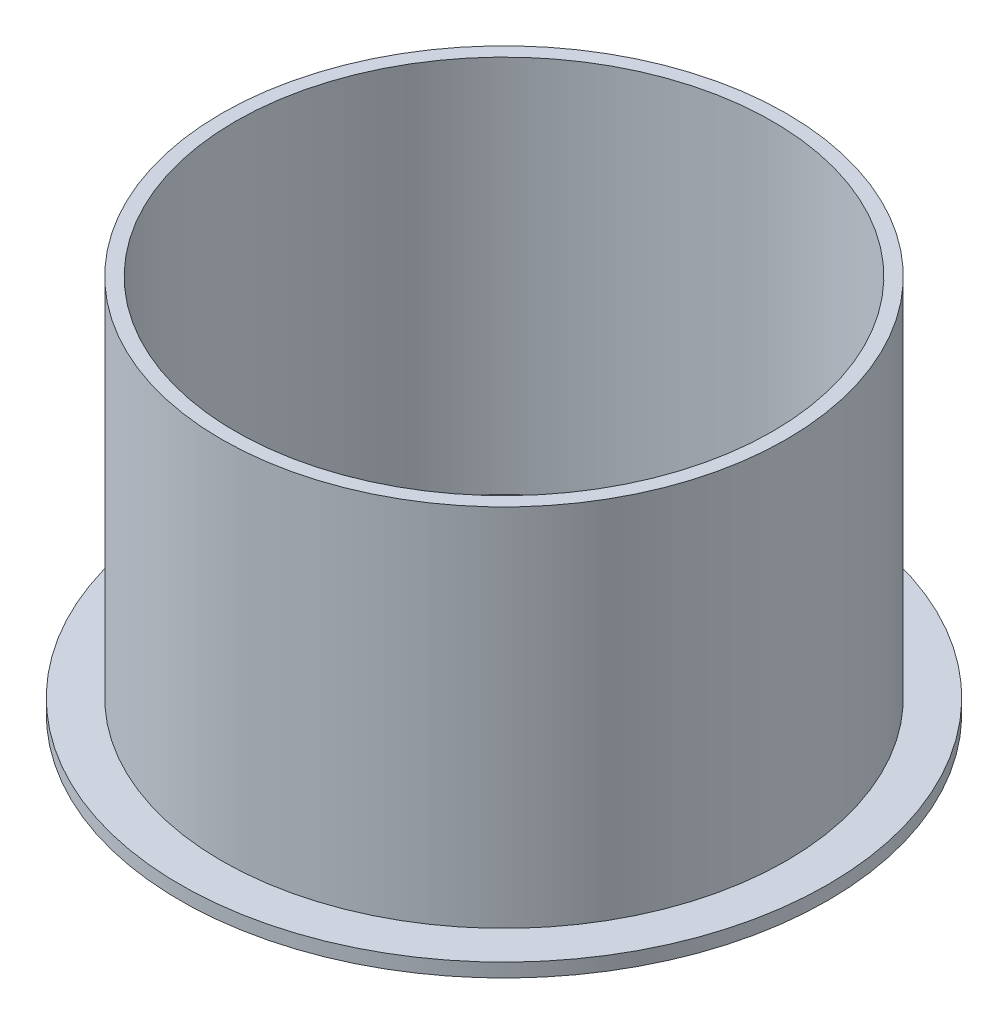
ISO-10303-21;
HEADER;
FILE_DESCRIPTION(('STEP AP214'),'2;1');
FILE_NAME('part.step','',(''),(''),'','','');
FILE_SCHEMA(('AUTOMOTIVE_DESIGN { 1 0 10303 214 1 1 1 1 }'));
ENDSEC;
DATA;
#1=APPLICATION_CONTEXT('core data for automotive mechanical design processes');
#2=APPLICATION_PROTOCOL_DEFINITION('international standard','automotive_design',2000,#1);
#3=PRODUCT_CONTEXT('',#1,'mechanical');
#4=PRODUCT('Part','Part','',(#3));
#5=PRODUCT_RELATED_PRODUCT_CATEGORY('part','',(#4));
#6=PRODUCT_DEFINITION_FORMATION('','',#4);
#7=PRODUCT_DEFINITION_CONTEXT('part definition',#1,'design');
#8=PRODUCT_DEFINITION('design','',#6,#7);
#9=PRODUCT_DEFINITION_SHAPE('','',#8);
#10=(LENGTH_UNIT() NAMED_UNIT(*) SI_UNIT(.MILLI.,.METRE.));
#11=(NAMED_UNIT(*) PLANE_ANGLE_UNIT() SI_UNIT($,.RADIAN.));
#12=(NAMED_UNIT(*) SI_UNIT($,.STERADIAN.) SOLID_ANGLE_UNIT());
#13=UNCERTAINTY_MEASURE_WITH_UNIT(LENGTH_MEASURE(1.E-05),#10,'distance_accuracy_value','');
#14=(GEOMETRIC_REPRESENTATION_CONTEXT(3) GLOBAL_UNCERTAINTY_ASSIGNED_CONTEXT((#13)) GLOBAL_UNIT_ASSIGNED_CONTEXT((#10,
#11,#12)) REPRESENTATION_CONTEXT('',''));
#15=CARTESIAN_POINT('',(0.,0.,0.));
#16=DIRECTION('',(0.,0.,1.));
#17=DIRECTION('',(1.,0.,0.));
#18=AXIS2_PLACEMENT_3D('',#15,#16,#17);
#19=CARTESIAN_POINT('',(0.,3.35402641779717,0.));
#20=DIRECTION('',(0.,1.,0.));
#21=DIRECTION('',(-1.,0.,0.));
#22=AXIS2_PLACEMENT_3D('',#19,#20,#21);
#23=CYLINDRICAL_SURFACE('',#22,41.);
#24=CARTESIAN_POINT('',(0.,-23.1459735822028,0.));
#25=DIRECTION('',(0.,1.,0.));
#26=DIRECTION('',(-1.,0.,0.));
#27=AXIS2_PLACEMENT_3D('',#24,#25,#26);
#28=CIRCLE('',#27,41.);
#29=CARTESIAN_POINT('',(-41.,-23.1459735822028,0.));
#30=VERTEX_POINT('',#29);
#31=EDGE_CURVE('E11',#30,#30,#28,.T.);
#32=ORIENTED_EDGE('',*,*,#31,.T.);
#33=EDGE_LOOP('',(#32));
#34=FACE_BOUND('',#33,.T.);
#35=CARTESIAN_POINT('',(0.,29.8540264177972,0.));
#36=DIRECTION('',(0.,1.,0.));
#37=DIRECTION('',(-1.,0.,0.));
#38=AXIS2_PLACEMENT_3D('',#35,#36,#37);
#39=CIRCLE('',#38,41.);
#40=CARTESIAN_POINT('',(-41.,29.8540264177972,0.));
#41=VERTEX_POINT('',#40);
#42=EDGE_CURVE('E56',#41,#41,#39,.T.);
#43=ORIENTED_EDGE('',*,*,#42,.F.);
#44=EDGE_LOOP('',(#43));
#45=FACE_BOUND('',#44,.T.);
#46=ADVANCED_FACE('F19',(#34,#45),#23,.T.);
#47=CARTESIAN_POINT('',(-44.,-23.1459735822028,0.));
#48=DIRECTION('',(0.,1.,0.));
#49=DIRECTION('',(1.,0.,0.));
#50=AXIS2_PLACEMENT_3D('',#47,#48,#49);
#51=PLANE('',#50);
#52=ORIENTED_EDGE('',*,*,#31,.F.);
#53=EDGE_LOOP('',(#52));
#54=FACE_BOUND('',#53,.T.);
#55=CARTESIAN_POINT('',(0.,-23.1459735822028,0.));
#56=DIRECTION('',(0.,1.,0.));
#57=DIRECTION('',(-1.,0.,0.));
#58=AXIS2_PLACEMENT_3D('',#55,#56,#57);
#59=CIRCLE('',#58,47.);
#60=CARTESIAN_POINT('',(-47.,-23.1459735822028,0.));
#61=VERTEX_POINT('',#60);
#62=EDGE_CURVE('E29',#61,#61,#59,.T.);
#63=ORIENTED_EDGE('',*,*,#62,.T.);
#64=EDGE_LOOP('',(#63));
#65=FACE_BOUND('',#64,.T.);
#66=ADVANCED_FACE('F96',(#54,#65),#51,.T.);
#67=CARTESIAN_POINT('',(0.,-24.1459735822028,0.));
#68=DIRECTION('',(0.,1.,0.));
#69=DIRECTION('',(-1.,0.,0.));
#70=AXIS2_PLACEMENT_3D('',#67,#68,#69);
#71=CYLINDRICAL_SURFACE('',#70,47.);
#72=CARTESIAN_POINT('',(0.,-25.1459735822028,0.));
#73=DIRECTION('',(0.,1.,0.));
#74=DIRECTION('',(-1.,0.,0.));
#75=AXIS2_PLACEMENT_3D('',#72,#73,#74);
#76=CIRCLE('',#75,47.);
#77=CARTESIAN_POINT('',(-47.,-25.1459735822028,0.));
#78=VERTEX_POINT('',#77);
#79=EDGE_CURVE('E22',#78,#78,#76,.T.);
#80=ORIENTED_EDGE('',*,*,#79,.T.);
#81=EDGE_LOOP('',(#80));
#82=FACE_BOUND('',#81,.T.);
#83=ORIENTED_EDGE('',*,*,#62,.F.);
#84=EDGE_LOOP('',(#83));
#85=FACE_BOUND('',#84,.T.);
#86=ADVANCED_FACE('F81',(#82,#85),#71,.T.);
#87=CARTESIAN_POINT('',(-43.,-25.1459735822028,0.));
#88=DIRECTION('',(0.,-1.,0.));
#89=DIRECTION('',(0.,0.,-1.));
#90=AXIS2_PLACEMENT_3D('',#87,#88,#89);
#91=PLANE('',#90);
#92=CARTESIAN_POINT('',(0.,-25.1459735822028,0.));
#93=DIRECTION('',(0.,1.,0.));
#94=DIRECTION('',(-1.,0.,0.));
#95=AXIS2_PLACEMENT_3D('',#92,#93,#94);
#96=CIRCLE('',#95,39.);
#97=CARTESIAN_POINT('',(-39.,-25.1459735822028,0.));
#98=VERTEX_POINT('',#97);
#99=EDGE_CURVE('E66',#98,#98,#96,.T.);
#100=ORIENTED_EDGE('',*,*,#99,.T.);
#101=EDGE_LOOP('',(#100));
#102=FACE_BOUND('',#101,.T.);
#103=ORIENTED_EDGE('',*,*,#79,.F.);
#104=EDGE_LOOP('',(#103));
#105=FACE_BOUND('',#104,.T.);
#106=ADVANCED_FACE('F84',(#102,#105),#91,.T.);
#107=CARTESIAN_POINT('',(0.,2.35402641779717,0.));
#108=DIRECTION('',(0.,1.,0.));
#109=DIRECTION('',(-1.,0.,0.));
#110=AXIS2_PLACEMENT_3D('',#107,#108,#109);
#111=CYLINDRICAL_SURFACE('',#110,39.);
#112=CARTESIAN_POINT('',(0.,29.8540264177972,0.));
#113=DIRECTION('',(0.,1.,0.));
#114=DIRECTION('',(-1.,0.,0.));
#115=AXIS2_PLACEMENT_3D('',#112,#113,#114);
#116=CIRCLE('',#115,39.);
#117=CARTESIAN_POINT('',(-39.,29.8540264177972,0.));
#118=VERTEX_POINT('',#117);
#119=EDGE_CURVE('E60',#118,#118,#116,.T.);
#120=ORIENTED_EDGE('',*,*,#119,.T.);
#121=EDGE_LOOP('',(#120));
#122=FACE_BOUND('',#121,.T.);
#123=ORIENTED_EDGE('',*,*,#99,.F.);
#124=EDGE_LOOP('',(#123));
#125=FACE_BOUND('',#124,.T.);
#126=ADVANCED_FACE('F86',(#122,#125),#111,.F.);
#127=CARTESIAN_POINT('',(-40.,29.8540264177972,0.));
#128=DIRECTION('',(0.,1.,0.));
#129=DIRECTION('',(1.,0.,0.));
#130=AXIS2_PLACEMENT_3D('',#127,#128,#129);
#131=PLANE('',#130);
#132=ORIENTED_EDGE('',*,*,#119,.F.);
#133=EDGE_LOOP('',(#132));
#134=FACE_BOUND('',#133,.T.);
#135=ORIENTED_EDGE('',*,*,#42,.T.);
#136=EDGE_LOOP('',(#135));
#137=FACE_BOUND('',#136,.T.);
#138=ADVANCED_FACE('F57',(#134,#137),#131,.T.);
#139=CLOSED_SHELL('',(#46,#66,#86,#106,#126,#138));
#140=MANIFOLD_SOLID_BREP('B1',#139);
#141=ADVANCED_BREP_SHAPE_REPRESENTATION('',(#18,#140),#14);
#142=SHAPE_DEFINITION_REPRESENTATION(#9,#141);
ENDSEC;
END-ISO-10303-21;
